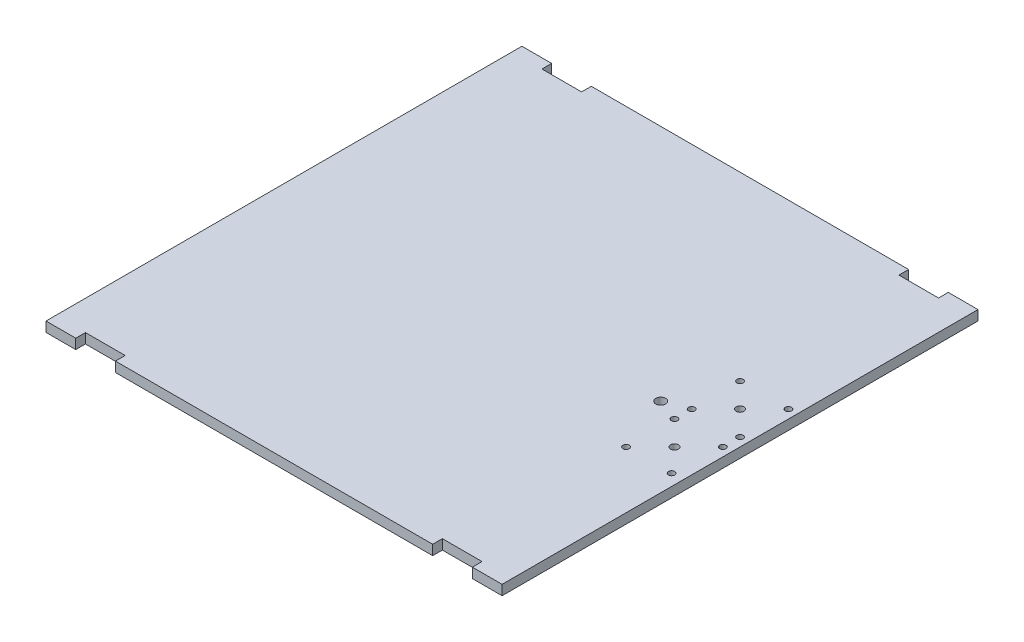
ISO-10303-21;
HEADER;
FILE_DESCRIPTION(('STEP AP214'),'2;1');
FILE_NAME('part.step','',(''),(''),'','','');
FILE_SCHEMA(('AUTOMOTIVE_DESIGN { 1 0 10303 214 1 1 1 1 }'));
ENDSEC;
DATA;
#1=APPLICATION_CONTEXT('core data for automotive mechanical design processes');
#2=APPLICATION_PROTOCOL_DEFINITION('international standard','automotive_design',2000,#1);
#3=PRODUCT_CONTEXT('',#1,'mechanical');
#4=PRODUCT('Part','Part','',(#3));
#5=PRODUCT_RELATED_PRODUCT_CATEGORY('part','',(#4));
#6=PRODUCT_DEFINITION_FORMATION('','',#4);
#7=PRODUCT_DEFINITION_CONTEXT('part definition',#1,'design');
#8=PRODUCT_DEFINITION('design','',#6,#7);
#9=PRODUCT_DEFINITION_SHAPE('','',#8);
#10=(LENGTH_UNIT() NAMED_UNIT(*) SI_UNIT(.MILLI.,.METRE.));
#11=(NAMED_UNIT(*) PLANE_ANGLE_UNIT() SI_UNIT($,.RADIAN.));
#12=(NAMED_UNIT(*) SI_UNIT($,.STERADIAN.) SOLID_ANGLE_UNIT());
#13=UNCERTAINTY_MEASURE_WITH_UNIT(LENGTH_MEASURE(1.E-05),#10,'distance_accuracy_value','');
#14=(GEOMETRIC_REPRESENTATION_CONTEXT(3) GLOBAL_UNCERTAINTY_ASSIGNED_CONTEXT((#13)) GLOBAL_UNIT_ASSIGNED_CONTEXT((#10,
#11,#12)) REPRESENTATION_CONTEXT('',''));
#15=CARTESIAN_POINT('',(0.,0.,0.));
#16=DIRECTION('',(0.,0.,1.));
#17=DIRECTION('',(1.,0.,0.));
#18=AXIS2_PLACEMENT_3D('',#15,#16,#17);
#19=CARTESIAN_POINT('',(0.,6.35,-304.8));
#20=DIRECTION('',(0.,0.,-1.));
#21=DIRECTION('',(-1.,0.,0.));
#22=AXIS2_PLACEMENT_3D('',#19,#20,#21);
#23=PLANE('',#22);
#24=DIRECTION('',(0.,1.,0.));
#25=VECTOR('',#24,1.);
#26=CARTESIAN_POINT('',(44.4500000000001,0.,-304.8));
#27=LINE('',#26,#25);
#28=CARTESIAN_POINT('',(44.4500000000001,0.,-304.8));
#29=VERTEX_POINT('',#28);
#30=CARTESIAN_POINT('',(44.4500000000001,6.35,-304.8));
#31=VERTEX_POINT('',#30);
#32=EDGE_CURVE('E376',#29,#31,#27,.T.);
#33=ORIENTED_EDGE('',*,*,#32,.T.);
#34=DIRECTION('',(1.,0.,0.));
#35=VECTOR('',#34,1.);
#36=CARTESIAN_POINT('',(0.,6.35,-304.8));
#37=LINE('',#36,#35);
#38=CARTESIAN_POINT('',(247.65,6.35,-304.8));
#39=VERTEX_POINT('',#38);
#40=EDGE_CURVE('E295',#31,#39,#37,.T.);
#41=ORIENTED_EDGE('',*,*,#40,.T.);
#42=DIRECTION('',(0.,-1.,0.));
#43=VECTOR('',#42,1.);
#44=CARTESIAN_POINT('',(247.65,6.35,-304.8));
#45=LINE('',#44,#43);
#46=CARTESIAN_POINT('',(247.65,0.,-304.8));
#47=VERTEX_POINT('',#46);
#48=EDGE_CURVE('E238',#39,#47,#45,.T.);
#49=ORIENTED_EDGE('',*,*,#48,.T.);
#50=DIRECTION('',(1.,0.,0.));
#51=VECTOR('',#50,1.);
#52=CARTESIAN_POINT('',(0.,0.,-304.8));
#53=LINE('',#52,#51);
#54=EDGE_CURVE('E269',#29,#47,#53,.T.);
#55=ORIENTED_EDGE('',*,*,#54,.F.);
#56=EDGE_LOOP('',(#33,#41,#49,#55));
#57=FACE_BOUND('',#56,.T.);
#58=ADVANCED_FACE('F39',(#57),#23,.T.);
#59=CARTESIAN_POINT('',(0.,6.35,0.));
#60=DIRECTION('',(0.,0.,-1.));
#61=DIRECTION('',(-1.,0.,0.));
#62=AXIS2_PLACEMENT_3D('',#59,#60,#61);
#63=PLANE('',#62);
#64=DIRECTION('',(1.,0.,0.));
#65=VECTOR('',#64,1.);
#66=CARTESIAN_POINT('',(0.,0.,0.));
#67=LINE('',#66,#65);
#68=CARTESIAN_POINT('',(0.,0.,0.));
#69=VERTEX_POINT('',#68);
#70=CARTESIAN_POINT('',(19.0500000000001,0.,-2.22044604925031E-13));
#71=VERTEX_POINT('',#70);
#72=EDGE_CURVE('E191',#69,#71,#67,.T.);
#73=ORIENTED_EDGE('',*,*,#72,.T.);
#74=DIRECTION('',(0.,1.,0.));
#75=VECTOR('',#74,1.);
#76=CARTESIAN_POINT('',(19.0500000000001,0.,-2.22044604925031E-13));
#77=LINE('',#76,#75);
#78=CARTESIAN_POINT('',(19.0500000000001,6.35,-2.22044604925031E-13));
#79=VERTEX_POINT('',#78);
#80=EDGE_CURVE('E175',#71,#79,#77,.T.);
#81=ORIENTED_EDGE('',*,*,#80,.T.);
#82=DIRECTION('',(1.,0.,0.));
#83=VECTOR('',#82,1.);
#84=CARTESIAN_POINT('',(0.,6.35,0.));
#85=LINE('',#84,#83);
#86=CARTESIAN_POINT('',(0.,6.35,0.));
#87=VERTEX_POINT('',#86);
#88=EDGE_CURVE('E305',#87,#79,#85,.T.);
#89=ORIENTED_EDGE('',*,*,#88,.F.);
#90=DIRECTION('',(0.,-1.,0.));
#91=VECTOR('',#90,1.);
#92=CARTESIAN_POINT('',(0.,6.35,0.));
#93=LINE('',#92,#91);
#94=EDGE_CURVE('E198',#87,#69,#93,.T.);
#95=ORIENTED_EDGE('',*,*,#94,.T.);
#96=EDGE_LOOP('',(#73,#81,#89,#95));
#97=FACE_BOUND('',#96,.T.);
#98=ADVANCED_FACE('F197',(#97),#63,.F.);
#99=CARTESIAN_POINT('',(292.1,6.35,0.));
#100=DIRECTION('',(-1.,0.,0.));
#101=DIRECTION('',(0.,0.,1.));
#102=AXIS2_PLACEMENT_3D('',#99,#100,#101);
#103=PLANE('',#102);
#104=DIRECTION('',(0.,0.,-1.));
#105=VECTOR('',#104,1.);
#106=CARTESIAN_POINT('',(292.1,0.,0.));
#107=LINE('',#106,#105);
#108=CARTESIAN_POINT('',(292.1,0.,0.));
#109=VERTEX_POINT('',#108);
#110=CARTESIAN_POINT('',(292.1,0.,-304.8));
#111=VERTEX_POINT('',#110);
#112=EDGE_CURVE('E267',#109,#111,#107,.T.);
#113=ORIENTED_EDGE('',*,*,#112,.T.);
#114=DIRECTION('',(0.,-1.,0.));
#115=VECTOR('',#114,1.);
#116=CARTESIAN_POINT('',(292.1,6.35,-304.8));
#117=LINE('',#116,#115);
#118=CARTESIAN_POINT('',(292.1,6.35,-304.8));
#119=VERTEX_POINT('',#118);
#120=EDGE_CURVE('E11',#119,#111,#117,.T.);
#121=ORIENTED_EDGE('',*,*,#120,.F.);
#122=DIRECTION('',(0.,0.,-1.));
#123=VECTOR('',#122,1.);
#124=CARTESIAN_POINT('',(292.1,6.35,0.));
#125=LINE('',#124,#123);
#126=CARTESIAN_POINT('',(292.1,6.35,0.));
#127=VERTEX_POINT('',#126);
#128=EDGE_CURVE('E207',#127,#119,#125,.T.);
#129=ORIENTED_EDGE('',*,*,#128,.F.);
#130=DIRECTION('',(0.,-1.,0.));
#131=VECTOR('',#130,1.);
#132=CARTESIAN_POINT('',(292.1,6.35,0.));
#133=LINE('',#132,#131);
#134=EDGE_CURVE('E222',#127,#109,#133,.T.);
#135=ORIENTED_EDGE('',*,*,#134,.T.);
#136=EDGE_LOOP('',(#113,#121,#129,#135));
#137=FACE_BOUND('',#136,.T.);
#138=ADVANCED_FACE('F41',(#137),#103,.F.);
#139=CARTESIAN_POINT('',(273.05,0.,-304.8));
#140=VERTEX_POINT('',#139);
#141=EDGE_CURVE('E259',#140,#111,#53,.T.);
#142=ORIENTED_EDGE('',*,*,#141,.F.);
#143=DIRECTION('',(0.,-1.,0.));
#144=VECTOR('',#143,1.);
#145=CARTESIAN_POINT('',(273.05,6.35,-304.8));
#146=LINE('',#145,#144);
#147=CARTESIAN_POINT('',(273.05,6.35,-304.8));
#148=VERTEX_POINT('',#147);
#149=EDGE_CURVE('E47',#148,#140,#146,.T.);
#150=ORIENTED_EDGE('',*,*,#149,.F.);
#151=EDGE_CURVE('E213',#148,#119,#37,.T.);
#152=ORIENTED_EDGE('',*,*,#151,.T.);
#153=ORIENTED_EDGE('',*,*,#120,.T.);
#154=EDGE_LOOP('',(#142,#150,#152,#153));
#155=FACE_BOUND('',#154,.T.);
#156=ADVANCED_FACE('F264',(#155),#23,.T.);
#157=CARTESIAN_POINT('',(273.05,6.35,0.));
#158=DIRECTION('',(1.,0.,0.));
#159=DIRECTION('',(0.,0.,-1.));
#160=AXIS2_PLACEMENT_3D('',#157,#158,#159);
#161=PLANE('',#160);
#162=DIRECTION('',(0.,0.,1.));
#163=VECTOR('',#162,1.);
#164=CARTESIAN_POINT('',(273.05,0.,0.));
#165=LINE('',#164,#163);
#166=CARTESIAN_POINT('',(273.05,0.,-298.577));
#167=VERTEX_POINT('',#166);
#168=EDGE_CURVE('E250',#140,#167,#165,.T.);
#169=ORIENTED_EDGE('',*,*,#168,.T.);
#170=DIRECTION('',(0.,-1.,0.));
#171=VECTOR('',#170,1.);
#172=CARTESIAN_POINT('',(273.05,6.35,-298.577));
#173=LINE('',#172,#171);
#174=CARTESIAN_POINT('',(273.05,6.35,-298.577));
#175=VERTEX_POINT('',#174);
#176=EDGE_CURVE('E243',#175,#167,#173,.T.);
#177=ORIENTED_EDGE('',*,*,#176,.F.);
#178=DIRECTION('',(0.,0.,1.));
#179=VECTOR('',#178,1.);
#180=CARTESIAN_POINT('',(273.05,6.35,0.));
#181=LINE('',#180,#179);
#182=EDGE_CURVE('E252',#148,#175,#181,.T.);
#183=ORIENTED_EDGE('',*,*,#182,.F.);
#184=ORIENTED_EDGE('',*,*,#149,.T.);
#185=EDGE_LOOP('',(#169,#177,#183,#184));
#186=FACE_BOUND('',#185,.T.);
#187=ADVANCED_FACE('F248',(#186),#161,.F.);
#188=CARTESIAN_POINT('',(0.,6.35,-298.577));
#189=DIRECTION('',(0.,0.,-1.));
#190=DIRECTION('',(-1.,0.,0.));
#191=AXIS2_PLACEMENT_3D('',#188,#189,#190);
#192=PLANE('',#191);
#193=DIRECTION('',(1.,0.,0.));
#194=VECTOR('',#193,1.);
#195=CARTESIAN_POINT('',(0.,0.,-298.577));
#196=LINE('',#195,#194);
#197=CARTESIAN_POINT('',(247.65,0.,-298.577));
#198=VERTEX_POINT('',#197);
#199=EDGE_CURVE('E262',#198,#167,#196,.T.);
#200=ORIENTED_EDGE('',*,*,#199,.F.);
#201=DIRECTION('',(0.,-1.,0.));
#202=VECTOR('',#201,1.);
#203=CARTESIAN_POINT('',(247.65,6.35,-298.577));
#204=LINE('',#203,#202);
#205=CARTESIAN_POINT('',(247.65,6.35,-298.577));
#206=VERTEX_POINT('',#205);
#207=EDGE_CURVE('E241',#206,#198,#204,.T.);
#208=ORIENTED_EDGE('',*,*,#207,.F.);
#209=DIRECTION('',(1.,0.,0.));
#210=VECTOR('',#209,1.);
#211=CARTESIAN_POINT('',(0.,6.35,-298.577));
#212=LINE('',#211,#210);
#213=EDGE_CURVE('E292',#206,#175,#212,.T.);
#214=ORIENTED_EDGE('',*,*,#213,.T.);
#215=ORIENTED_EDGE('',*,*,#176,.T.);
#216=EDGE_LOOP('',(#200,#208,#214,#215));
#217=FACE_BOUND('',#216,.T.);
#218=ADVANCED_FACE('F291',(#217),#192,.T.);
#219=CARTESIAN_POINT('',(247.65,6.35,0.));
#220=DIRECTION('',(1.,0.,0.));
#221=DIRECTION('',(0.,0.,-1.));
#222=AXIS2_PLACEMENT_3D('',#219,#220,#221);
#223=PLANE('',#222);
#224=DIRECTION('',(0.,0.,1.));
#225=VECTOR('',#224,1.);
#226=CARTESIAN_POINT('',(247.65,0.,0.));
#227=LINE('',#226,#225);
#228=EDGE_CURVE('E273',#47,#198,#227,.T.);
#229=ORIENTED_EDGE('',*,*,#228,.F.);
#230=ORIENTED_EDGE('',*,*,#48,.F.);
#231=DIRECTION('',(0.,0.,1.));
#232=VECTOR('',#231,1.);
#233=CARTESIAN_POINT('',(247.65,6.35,0.));
#234=LINE('',#233,#232);
#235=EDGE_CURVE('E287',#39,#206,#234,.T.);
#236=ORIENTED_EDGE('',*,*,#235,.T.);
#237=ORIENTED_EDGE('',*,*,#207,.T.);
#238=EDGE_LOOP('',(#229,#230,#236,#237));
#239=FACE_BOUND('',#238,.T.);
#240=ADVANCED_FACE('F284',(#239),#223,.T.);
#241=DIRECTION('',(0.,1.,0.));
#242=VECTOR('',#241,1.);
#243=CARTESIAN_POINT('',(19.0500000000001,0.,-304.8));
#244=LINE('',#243,#242);
#245=CARTESIAN_POINT('',(19.0500000000001,0.,-304.8));
#246=VERTEX_POINT('',#245);
#247=CARTESIAN_POINT('',(19.0500000000001,6.35,-304.8));
#248=VERTEX_POINT('',#247);
#249=EDGE_CURVE('E346',#246,#248,#244,.T.);
#250=ORIENTED_EDGE('',*,*,#249,.F.);
#251=CARTESIAN_POINT('',(0.,0.,-304.8));
#252=VERTEX_POINT('',#251);
#253=EDGE_CURVE('E270',#252,#246,#53,.T.);
#254=ORIENTED_EDGE('',*,*,#253,.F.);
#255=DIRECTION('',(0.,-1.,0.));
#256=VECTOR('',#255,1.);
#257=CARTESIAN_POINT('',(0.,6.35,-304.8));
#258=LINE('',#257,#256);
#259=CARTESIAN_POINT('',(0.,6.35,-304.8));
#260=VERTEX_POINT('',#259);
#261=EDGE_CURVE('E236',#260,#252,#258,.T.);
#262=ORIENTED_EDGE('',*,*,#261,.F.);
#263=EDGE_CURVE('E304',#260,#248,#37,.T.);
#264=ORIENTED_EDGE('',*,*,#263,.T.);
#265=EDGE_LOOP('',(#250,#254,#262,#264));
#266=FACE_BOUND('',#265,.T.);
#267=ADVANCED_FACE('F345',(#266),#23,.T.);
#268=CARTESIAN_POINT('',(0.,6.35,0.));
#269=DIRECTION('',(-1.,0.,0.));
#270=DIRECTION('',(0.,0.,1.));
#271=AXIS2_PLACEMENT_3D('',#268,#269,#270);
#272=PLANE('',#271);
#273=DIRECTION('',(0.,0.,-1.));
#274=VECTOR('',#273,1.);
#275=CARTESIAN_POINT('',(0.,0.,0.));
#276=LINE('',#275,#274);
#277=EDGE_CURVE('E205',#69,#252,#276,.T.);
#278=ORIENTED_EDGE('',*,*,#277,.F.);
#279=ORIENTED_EDGE('',*,*,#94,.F.);
#280=DIRECTION('',(0.,0.,-1.));
#281=VECTOR('',#280,1.);
#282=CARTESIAN_POINT('',(0.,6.35,0.));
#283=LINE('',#282,#281);
#284=EDGE_CURVE('E300',#87,#260,#283,.T.);
#285=ORIENTED_EDGE('',*,*,#284,.T.);
#286=ORIENTED_EDGE('',*,*,#261,.T.);
#287=EDGE_LOOP('',(#278,#279,#285,#286));
#288=FACE_BOUND('',#287,.T.);
#289=ADVANCED_FACE('F353',(#288),#272,.T.);
#290=CARTESIAN_POINT('',(44.4500000000001,6.35,-2.22044604925031E-13));
#291=VERTEX_POINT('',#290);
#292=CARTESIAN_POINT('',(247.65,6.35,0.));
#293=VERTEX_POINT('',#292);
#294=EDGE_CURVE('E303',#291,#293,#85,.T.);
#295=ORIENTED_EDGE('',*,*,#294,.F.);
#296=DIRECTION('',(0.,1.,0.));
#297=VECTOR('',#296,1.);
#298=CARTESIAN_POINT('',(44.4500000000001,0.,-2.22044604925031E-13));
#299=LINE('',#298,#297);
#300=CARTESIAN_POINT('',(44.4500000000001,0.,-2.22044604925031E-13));
#301=VERTEX_POINT('',#300);
#302=EDGE_CURVE('E185',#301,#291,#299,.T.);
#303=ORIENTED_EDGE('',*,*,#302,.F.);
#304=CARTESIAN_POINT('',(247.65,0.,0.));
#305=VERTEX_POINT('',#304);
#306=EDGE_CURVE('E200',#301,#305,#67,.T.);
#307=ORIENTED_EDGE('',*,*,#306,.T.);
#308=DIRECTION('',(0.,-1.,0.));
#309=VECTOR('',#308,1.);
#310=CARTESIAN_POINT('',(247.65,6.35,0.));
#311=LINE('',#310,#309);
#312=EDGE_CURVE('E232',#293,#305,#311,.T.);
#313=ORIENTED_EDGE('',*,*,#312,.F.);
#314=EDGE_LOOP('',(#295,#303,#307,#313));
#315=FACE_BOUND('',#314,.T.);
#316=ADVANCED_FACE('F328',(#315),#63,.F.);
#317=CARTESIAN_POINT('',(247.65,6.35,0.));
#318=DIRECTION('',(-1.,0.,0.));
#319=DIRECTION('',(0.,0.,1.));
#320=AXIS2_PLACEMENT_3D('',#317,#318,#319);
#321=PLANE('',#320);
#322=DIRECTION('',(0.,0.,-1.));
#323=VECTOR('',#322,1.);
#324=CARTESIAN_POINT('',(247.65,0.,0.));
#325=LINE('',#324,#323);
#326=CARTESIAN_POINT('',(247.65,0.,-6.223));
#327=VERTEX_POINT('',#326);
#328=EDGE_CURVE('E199',#305,#327,#325,.T.);
#329=ORIENTED_EDGE('',*,*,#328,.T.);
#330=DIRECTION('',(0.,-1.,0.));
#331=VECTOR('',#330,1.);
#332=CARTESIAN_POINT('',(247.65,6.35,-6.223));
#333=LINE('',#332,#331);
#334=CARTESIAN_POINT('',(247.65,6.35,-6.223));
#335=VERTEX_POINT('',#334);
#336=EDGE_CURVE('E229',#335,#327,#333,.T.);
#337=ORIENTED_EDGE('',*,*,#336,.F.);
#338=DIRECTION('',(0.,0.,-1.));
#339=VECTOR('',#338,1.);
#340=CARTESIAN_POINT('',(247.65,6.35,0.));
#341=LINE('',#340,#339);
#342=EDGE_CURVE('E307',#293,#335,#341,.T.);
#343=ORIENTED_EDGE('',*,*,#342,.F.);
#344=ORIENTED_EDGE('',*,*,#312,.T.);
#345=EDGE_LOOP('',(#329,#337,#343,#344));
#346=FACE_BOUND('',#345,.T.);
#347=ADVANCED_FACE('F332',(#346),#321,.F.);
#348=CARTESIAN_POINT('',(0.,6.35,-6.223));
#349=DIRECTION('',(0.,0.,-1.));
#350=DIRECTION('',(-1.,0.,0.));
#351=AXIS2_PLACEMENT_3D('',#348,#349,#350);
#352=PLANE('',#351);
#353=DIRECTION('',(1.,0.,0.));
#354=VECTOR('',#353,1.);
#355=CARTESIAN_POINT('',(0.,0.,-6.223));
#356=LINE('',#355,#354);
#357=CARTESIAN_POINT('',(273.05,0.,-6.223));
#358=VERTEX_POINT('',#357);
#359=EDGE_CURVE('E203',#327,#358,#356,.T.);
#360=ORIENTED_EDGE('',*,*,#359,.T.);
#361=DIRECTION('',(0.,-1.,0.));
#362=VECTOR('',#361,1.);
#363=CARTESIAN_POINT('',(273.05,6.35,-6.223));
#364=LINE('',#363,#362);
#365=CARTESIAN_POINT('',(273.05,6.35,-6.223));
#366=VERTEX_POINT('',#365);
#367=EDGE_CURVE('E227',#366,#358,#364,.T.);
#368=ORIENTED_EDGE('',*,*,#367,.F.);
#369=DIRECTION('',(1.,0.,0.));
#370=VECTOR('',#369,1.);
#371=CARTESIAN_POINT('',(0.,6.35,-6.223));
#372=LINE('',#371,#370);
#373=EDGE_CURVE('E309',#335,#366,#372,.T.);
#374=ORIENTED_EDGE('',*,*,#373,.F.);
#375=ORIENTED_EDGE('',*,*,#336,.T.);
#376=EDGE_LOOP('',(#360,#368,#374,#375));
#377=FACE_BOUND('',#376,.T.);
#378=ADVANCED_FACE('F336',(#377),#352,.F.);
#379=CARTESIAN_POINT('',(273.05,6.35,0.));
#380=DIRECTION('',(-1.,0.,0.));
#381=DIRECTION('',(0.,0.,1.));
#382=AXIS2_PLACEMENT_3D('',#379,#380,#381);
#383=PLANE('',#382);
#384=DIRECTION('',(0.,0.,-1.));
#385=VECTOR('',#384,1.);
#386=CARTESIAN_POINT('',(273.05,0.,0.));
#387=LINE('',#386,#385);
#388=CARTESIAN_POINT('',(273.05,0.,0.));
#389=VERTEX_POINT('',#388);
#390=EDGE_CURVE('E208',#389,#358,#387,.T.);
#391=ORIENTED_EDGE('',*,*,#390,.F.);
#392=DIRECTION('',(0.,-1.,0.));
#393=VECTOR('',#392,1.);
#394=CARTESIAN_POINT('',(273.05,6.35,0.));
#395=LINE('',#394,#393);
#396=CARTESIAN_POINT('',(273.05,6.35,0.));
#397=VERTEX_POINT('',#396);
#398=EDGE_CURVE('E224',#397,#389,#395,.T.);
#399=ORIENTED_EDGE('',*,*,#398,.F.);
#400=DIRECTION('',(0.,0.,-1.));
#401=VECTOR('',#400,1.);
#402=CARTESIAN_POINT('',(273.05,6.35,0.));
#403=LINE('',#402,#401);
#404=EDGE_CURVE('E311',#397,#366,#403,.T.);
#405=ORIENTED_EDGE('',*,*,#404,.T.);
#406=ORIENTED_EDGE('',*,*,#367,.T.);
#407=EDGE_LOOP('',(#391,#399,#405,#406));
#408=FACE_BOUND('',#407,.T.);
#409=ADVANCED_FACE('F337',(#408),#383,.T.);
#410=EDGE_CURVE('E202',#389,#109,#67,.T.);
#411=ORIENTED_EDGE('',*,*,#410,.T.);
#412=ORIENTED_EDGE('',*,*,#134,.F.);
#413=EDGE_CURVE('E225',#397,#127,#85,.T.);
#414=ORIENTED_EDGE('',*,*,#413,.F.);
#415=ORIENTED_EDGE('',*,*,#398,.T.);
#416=EDGE_LOOP('',(#411,#412,#414,#415));
#417=FACE_BOUND('',#416,.T.);
#418=ADVANCED_FACE('F338',(#417),#63,.F.);
#419=CARTESIAN_POINT('',(0.,6.35,0.));
#420=DIRECTION('',(0.,1.,0.));
#421=DIRECTION('',(0.,0.,1.));
#422=AXIS2_PLACEMENT_3D('',#419,#420,#421);
#423=PLANE('',#422);
#424=CARTESIAN_POINT('',(241.3,6.35,-152.4));
#425=DIRECTION('',(0.,1.,0.));
#426=DIRECTION('',(0.,0.,1.));
#427=AXIS2_PLACEMENT_3D('',#424,#425,#426);
#428=CIRCLE('',#427,3.175);
#429=CARTESIAN_POINT('',(241.3,6.35,-149.225));
#430=VERTEX_POINT('',#429);
#431=EDGE_CURVE('E408',#430,#430,#428,.T.);
#432=ORIENTED_EDGE('',*,*,#431,.F.);
#433=EDGE_LOOP('',(#432));
#434=FACE_BOUND('',#433,.T.);
#435=CARTESIAN_POINT('',(255.6,6.35,-115.9));
#436=DIRECTION('',(0.,1.,0.));
#437=DIRECTION('',(0.,0.,1.));
#438=AXIS2_PLACEMENT_3D('',#435,#436,#437);
#439=CIRCLE('',#438,2.);
#440=CARTESIAN_POINT('',(255.6,6.35,-113.9));
#441=VERTEX_POINT('',#440);
#442=EDGE_CURVE('E402',#441,#441,#439,.T.);
#443=ORIENTED_EDGE('',*,*,#442,.F.);
#444=EDGE_LOOP('',(#443));
#445=FACE_BOUND('',#444,.T.);
#446=CARTESIAN_POINT('',(284.763488048272,6.35,-115.9));
#447=DIRECTION('',(0.,1.,0.));
#448=DIRECTION('',(0.,0.,1.));
#449=AXIS2_PLACEMENT_3D('',#446,#447,#448);
#450=CIRCLE('',#449,2.);
#451=CARTESIAN_POINT('',(284.763488048272,6.35,-113.9));
#452=VERTEX_POINT('',#451);
#453=EDGE_CURVE('E396',#452,#452,#450,.T.);
#454=ORIENTED_EDGE('',*,*,#453,.F.);
#455=EDGE_LOOP('',(#454));
#456=FACE_BOUND('',#455,.T.);
#457=CARTESIAN_POINT('',(286.6,6.35,-146.9));
#458=DIRECTION('',(0.,1.,0.));
#459=DIRECTION('',(0.,0.,1.));
#460=AXIS2_PLACEMENT_3D('',#457,#458,#459);
#461=CIRCLE('',#460,2.);
#462=CARTESIAN_POINT('',(286.6,6.35,-144.9));
#463=VERTEX_POINT('',#462);
#464=EDGE_CURVE('E390',#463,#463,#461,.T.);
#465=ORIENTED_EDGE('',*,*,#464,.F.);
#466=EDGE_LOOP('',(#465));
#467=FACE_BOUND('',#466,.T.);
#468=CARTESIAN_POINT('',(286.6,6.35,-157.9));
#469=DIRECTION('',(0.,1.,0.));
#470=DIRECTION('',(0.,0.,1.));
#471=AXIS2_PLACEMENT_3D('',#468,#469,#470);
#472=CIRCLE('',#471,2.);
#473=CARTESIAN_POINT('',(286.6,6.35,-155.9));
#474=VERTEX_POINT('',#473);
#475=EDGE_CURVE('E428',#474,#474,#472,.T.);
#476=ORIENTED_EDGE('',*,*,#475,.F.);
#477=EDGE_LOOP('',(#476));
#478=FACE_BOUND('',#477,.T.);
#479=CARTESIAN_POINT('',(255.6,6.35,-157.9));
#480=DIRECTION('',(0.,1.,0.));
#481=DIRECTION('',(0.,0.,1.));
#482=AXIS2_PLACEMENT_3D('',#479,#480,#481);
#483=CIRCLE('',#482,2.);
#484=CARTESIAN_POINT('',(255.6,6.35,-155.9));
#485=VERTEX_POINT('',#484);
#486=EDGE_CURVE('E415',#485,#485,#483,.T.);
#487=ORIENTED_EDGE('',*,*,#486,.F.);
#488=EDGE_LOOP('',(#487));
#489=FACE_BOUND('',#488,.T.);
#490=CARTESIAN_POINT('',(255.6,6.35,-188.9));
#491=DIRECTION('',(0.,1.,0.));
#492=DIRECTION('',(0.,0.,1.));
#493=AXIS2_PLACEMENT_3D('',#490,#491,#492);
#494=CIRCLE('',#493,2.);
#495=CARTESIAN_POINT('',(255.6,6.35,-186.9));
#496=VERTEX_POINT('',#495);
#497=EDGE_CURVE('E416',#496,#496,#494,.T.);
#498=ORIENTED_EDGE('',*,*,#497,.F.);
#499=EDGE_LOOP('',(#498));
#500=FACE_BOUND('',#499,.T.);
#501=CARTESIAN_POINT('',(255.6,6.35,-146.9));
#502=DIRECTION('',(0.,1.,0.));
#503=DIRECTION('',(0.,0.,1.));
#504=AXIS2_PLACEMENT_3D('',#501,#502,#503);
#505=CIRCLE('',#504,2.);
#506=CARTESIAN_POINT('',(255.6,6.35,-144.9));
#507=VERTEX_POINT('',#506);
#508=EDGE_CURVE('E389',#507,#507,#505,.T.);
#509=ORIENTED_EDGE('',*,*,#508,.F.);
#510=EDGE_LOOP('',(#509));
#511=FACE_BOUND('',#510,.T.);
#512=CARTESIAN_POINT('',(271.1,6.35,-131.4));
#513=DIRECTION('',(0.,1.,0.));
#514=DIRECTION('',(0.,0.,1.));
#515=AXIS2_PLACEMENT_3D('',#512,#513,#514);
#516=CIRCLE('',#515,2.50000000000002);
#517=CARTESIAN_POINT('',(271.1,6.35,-128.9));
#518=VERTEX_POINT('',#517);
#519=EDGE_CURVE('E366',#518,#518,#516,.T.);
#520=ORIENTED_EDGE('',*,*,#519,.F.);
#521=EDGE_LOOP('',(#520));
#522=FACE_BOUND('',#521,.T.);
#523=CARTESIAN_POINT('',(271.1,6.35,-173.4));
#524=DIRECTION('',(0.,1.,0.));
#525=DIRECTION('',(0.,0.,1.));
#526=AXIS2_PLACEMENT_3D('',#523,#524,#525);
#527=CIRCLE('',#526,2.50000000000002);
#528=CARTESIAN_POINT('',(271.1,6.35,-170.9));
#529=VERTEX_POINT('',#528);
#530=EDGE_CURVE('E751',#529,#529,#527,.T.);
#531=ORIENTED_EDGE('',*,*,#530,.F.);
#532=EDGE_LOOP('',(#531));
#533=FACE_BOUND('',#532,.T.);
#534=DIRECTION('',(0.,0.,1.));
#535=VECTOR('',#534,1.);
#536=CARTESIAN_POINT('',(19.0500000000001,6.35,-6.22300000000022));
#537=LINE('',#536,#535);
#538=CARTESIAN_POINT('',(19.0500000000001,6.35,-6.22300000000022));
#539=VERTEX_POINT('',#538);
#540=EDGE_CURVE('E180',#539,#79,#537,.T.);
#541=ORIENTED_EDGE('',*,*,#540,.F.);
#542=DIRECTION('',(-1.,0.,0.));
#543=VECTOR('',#542,1.);
#544=CARTESIAN_POINT('',(19.0500000000001,6.35,-6.22300000000022));
#545=LINE('',#544,#543);
#546=CARTESIAN_POINT('',(44.4500000000001,6.35,-6.22300000000022));
#547=VERTEX_POINT('',#546);
#548=EDGE_CURVE('E195',#547,#539,#545,.T.);
#549=ORIENTED_EDGE('',*,*,#548,.F.);
#550=DIRECTION('',(0.,0.,-1.));
#551=VECTOR('',#550,1.);
#552=CARTESIAN_POINT('',(44.4500000000001,6.35,-6.22300000000022));
#553=LINE('',#552,#551);
#554=EDGE_CURVE('E325',#291,#547,#553,.T.);
#555=ORIENTED_EDGE('',*,*,#554,.F.);
#556=ORIENTED_EDGE('',*,*,#294,.T.);
#557=ORIENTED_EDGE('',*,*,#342,.T.);
#558=ORIENTED_EDGE('',*,*,#373,.T.);
#559=ORIENTED_EDGE('',*,*,#404,.F.);
#560=ORIENTED_EDGE('',*,*,#413,.T.);
#561=ORIENTED_EDGE('',*,*,#128,.T.);
#562=ORIENTED_EDGE('',*,*,#151,.F.);
#563=ORIENTED_EDGE('',*,*,#182,.T.);
#564=ORIENTED_EDGE('',*,*,#213,.F.);
#565=ORIENTED_EDGE('',*,*,#235,.F.);
#566=ORIENTED_EDGE('',*,*,#40,.F.);
#567=DIRECTION('',(0.,0.,-1.));
#568=VECTOR('',#567,1.);
#569=CARTESIAN_POINT('',(44.4500000000001,6.35,-304.8));
#570=LINE('',#569,#568);
#571=CARTESIAN_POINT('',(44.4500000000001,6.35,-298.577));
#572=VERTEX_POINT('',#571);
#573=EDGE_CURVE('E377',#572,#31,#570,.T.);
#574=ORIENTED_EDGE('',*,*,#573,.F.);
#575=DIRECTION('',(1.,0.,0.));
#576=VECTOR('',#575,1.);
#577=CARTESIAN_POINT('',(44.4500000000001,6.35,-298.577));
#578=LINE('',#577,#576);
#579=CARTESIAN_POINT('',(19.0500000000001,6.35,-298.577));
#580=VERTEX_POINT('',#579);
#581=EDGE_CURVE('E373',#580,#572,#578,.T.);
#582=ORIENTED_EDGE('',*,*,#581,.F.);
#583=DIRECTION('',(0.,0.,1.));
#584=VECTOR('',#583,1.);
#585=CARTESIAN_POINT('',(19.0500000000001,6.35,-304.8));
#586=LINE('',#585,#584);
#587=EDGE_CURVE('E351',#248,#580,#586,.T.);
#588=ORIENTED_EDGE('',*,*,#587,.F.);
#589=ORIENTED_EDGE('',*,*,#263,.F.);
#590=ORIENTED_EDGE('',*,*,#284,.F.);
#591=ORIENTED_EDGE('',*,*,#88,.T.);
#592=EDGE_LOOP('',(#541,#549,#555,#556,#557,#558,#559,#560,#561,#562,#563,#564,#565,#566,#574,
#582,#588,#589,#590,#591));
#593=FACE_BOUND('',#592,.T.);
#594=CARTESIAN_POINT('',(286.6,6.35,-188.9));
#595=DIRECTION('',(0.,1.,0.));
#596=DIRECTION('',(0.,0.,1.));
#597=AXIS2_PLACEMENT_3D('',#594,#595,#596);
#598=CIRCLE('',#597,2.);
#599=CARTESIAN_POINT('',(286.6,6.35,-186.9));
#600=VERTEX_POINT('',#599);
#601=EDGE_CURVE('E427',#600,#600,#598,.T.);
#602=ORIENTED_EDGE('',*,*,#601,.F.);
#603=EDGE_LOOP('',(#602));
#604=FACE_BOUND('',#603,.T.);
#605=ADVANCED_FACE('F319',(#434,#445,#456,#467,#478,#489,#500,#511,#522,#533,#593,#604),#423,.T.);
#606=CARTESIAN_POINT('',(0.,0.,0.));
#607=DIRECTION('',(0.,1.,0.));
#608=DIRECTION('',(0.,0.,1.));
#609=AXIS2_PLACEMENT_3D('',#606,#607,#608);
#610=PLANE('',#609);
#611=CARTESIAN_POINT('',(241.3,0.,-152.4));
#612=DIRECTION('',(0.,1.,0.));
#613=DIRECTION('',(0.,0.,1.));
#614=AXIS2_PLACEMENT_3D('',#611,#612,#613);
#615=CIRCLE('',#614,3.175);
#616=CARTESIAN_POINT('',(241.3,0.,-149.225));
#617=VERTEX_POINT('',#616);
#618=EDGE_CURVE('E405',#617,#617,#615,.T.);
#619=ORIENTED_EDGE('',*,*,#618,.T.);
#620=EDGE_LOOP('',(#619));
#621=FACE_BOUND('',#620,.T.);
#622=CARTESIAN_POINT('',(255.6,0.,-115.9));
#623=DIRECTION('',(0.,1.,0.));
#624=DIRECTION('',(0.,0.,1.));
#625=AXIS2_PLACEMENT_3D('',#622,#623,#624);
#626=CIRCLE('',#625,2.);
#627=CARTESIAN_POINT('',(255.6,0.,-113.9));
#628=VERTEX_POINT('',#627);
#629=EDGE_CURVE('E399',#628,#628,#626,.T.);
#630=ORIENTED_EDGE('',*,*,#629,.T.);
#631=EDGE_LOOP('',(#630));
#632=FACE_BOUND('',#631,.T.);
#633=CARTESIAN_POINT('',(284.763488048272,0.,-115.9));
#634=DIRECTION('',(0.,1.,0.));
#635=DIRECTION('',(0.,0.,1.));
#636=AXIS2_PLACEMENT_3D('',#633,#634,#635);
#637=CIRCLE('',#636,2.);
#638=CARTESIAN_POINT('',(284.763488048272,0.,-113.9));
#639=VERTEX_POINT('',#638);
#640=EDGE_CURVE('E393',#639,#639,#637,.T.);
#641=ORIENTED_EDGE('',*,*,#640,.T.);
#642=EDGE_LOOP('',(#641));
#643=FACE_BOUND('',#642,.T.);
#644=CARTESIAN_POINT('',(286.6,0.,-146.9));
#645=DIRECTION('',(0.,1.,0.));
#646=DIRECTION('',(0.,0.,1.));
#647=AXIS2_PLACEMENT_3D('',#644,#645,#646);
#648=CIRCLE('',#647,2.);
#649=CARTESIAN_POINT('',(286.6,0.,-144.9));
#650=VERTEX_POINT('',#649);
#651=EDGE_CURVE('E386',#650,#650,#648,.T.);
#652=ORIENTED_EDGE('',*,*,#651,.T.);
#653=EDGE_LOOP('',(#652));
#654=FACE_BOUND('',#653,.T.);
#655=CARTESIAN_POINT('',(286.6,0.,-157.9));
#656=DIRECTION('',(0.,1.,0.));
#657=DIRECTION('',(0.,0.,1.));
#658=AXIS2_PLACEMENT_3D('',#655,#656,#657);
#659=CIRCLE('',#658,2.);
#660=CARTESIAN_POINT('',(286.6,0.,-155.9));
#661=VERTEX_POINT('',#660);
#662=EDGE_CURVE('E424',#661,#661,#659,.T.);
#663=ORIENTED_EDGE('',*,*,#662,.T.);
#664=EDGE_LOOP('',(#663));
#665=FACE_BOUND('',#664,.T.);
#666=CARTESIAN_POINT('',(255.6,0.,-157.9));
#667=DIRECTION('',(0.,1.,0.));
#668=DIRECTION('',(0.,0.,1.));
#669=AXIS2_PLACEMENT_3D('',#666,#667,#668);
#670=CIRCLE('',#669,2.);
#671=CARTESIAN_POINT('',(255.6,0.,-155.9));
#672=VERTEX_POINT('',#671);
#673=EDGE_CURVE('E431',#672,#672,#670,.T.);
#674=ORIENTED_EDGE('',*,*,#673,.T.);
#675=EDGE_LOOP('',(#674));
#676=FACE_BOUND('',#675,.T.);
#677=CARTESIAN_POINT('',(255.6,0.,-188.9));
#678=DIRECTION('',(0.,1.,0.));
#679=DIRECTION('',(0.,0.,1.));
#680=AXIS2_PLACEMENT_3D('',#677,#678,#679);
#681=CIRCLE('',#680,2.);
#682=CARTESIAN_POINT('',(255.6,0.,-186.9));
#683=VERTEX_POINT('',#682);
#684=EDGE_CURVE('E412',#683,#683,#681,.T.);
#685=ORIENTED_EDGE('',*,*,#684,.T.);
#686=EDGE_LOOP('',(#685));
#687=FACE_BOUND('',#686,.T.);
#688=CARTESIAN_POINT('',(255.6,0.,-146.9));
#689=DIRECTION('',(0.,1.,0.));
#690=DIRECTION('',(0.,0.,1.));
#691=AXIS2_PLACEMENT_3D('',#688,#689,#690);
#692=CIRCLE('',#691,2.);
#693=CARTESIAN_POINT('',(255.6,0.,-144.9));
#694=VERTEX_POINT('',#693);
#695=EDGE_CURVE('E419',#694,#694,#692,.T.);
#696=ORIENTED_EDGE('',*,*,#695,.T.);
#697=EDGE_LOOP('',(#696));
#698=FACE_BOUND('',#697,.T.);
#699=CARTESIAN_POINT('',(271.1,0.,-131.4));
#700=DIRECTION('',(0.,1.,0.));
#701=DIRECTION('',(0.,0.,1.));
#702=AXIS2_PLACEMENT_3D('',#699,#700,#701);
#703=CIRCLE('',#702,2.50000000000002);
#704=CARTESIAN_POINT('',(271.1,0.,-128.9));
#705=VERTEX_POINT('',#704);
#706=EDGE_CURVE('E746',#705,#705,#703,.T.);
#707=ORIENTED_EDGE('',*,*,#706,.T.);
#708=EDGE_LOOP('',(#707));
#709=FACE_BOUND('',#708,.T.);
#710=CARTESIAN_POINT('',(271.1,0.,-173.4));
#711=DIRECTION('',(0.,1.,0.));
#712=DIRECTION('',(0.,0.,1.));
#713=AXIS2_PLACEMENT_3D('',#710,#711,#712);
#714=CIRCLE('',#713,2.50000000000002);
#715=CARTESIAN_POINT('',(271.1,0.,-170.9));
#716=VERTEX_POINT('',#715);
#717=EDGE_CURVE('E411',#716,#716,#714,.T.);
#718=ORIENTED_EDGE('',*,*,#717,.T.);
#719=EDGE_LOOP('',(#718));
#720=FACE_BOUND('',#719,.T.);
#721=CARTESIAN_POINT('',(286.6,0.,-188.9));
#722=DIRECTION('',(0.,1.,0.));
#723=DIRECTION('',(0.,0.,1.));
#724=AXIS2_PLACEMENT_3D('',#721,#722,#723);
#725=CIRCLE('',#724,2.);
#726=CARTESIAN_POINT('',(286.6,0.,-186.9));
#727=VERTEX_POINT('',#726);
#728=EDGE_CURVE('E271',#727,#727,#725,.T.);
#729=ORIENTED_EDGE('',*,*,#728,.T.);
#730=EDGE_LOOP('',(#729));
#731=FACE_BOUND('',#730,.T.);
#732=DIRECTION('',(-1.,0.,0.));
#733=VECTOR('',#732,1.);
#734=CARTESIAN_POINT('',(19.0500000000001,0.,-6.22300000000022));
#735=LINE('',#734,#733);
#736=CARTESIAN_POINT('',(44.4500000000001,0.,-6.22300000000022));
#737=VERTEX_POINT('',#736);
#738=CARTESIAN_POINT('',(19.0500000000001,0.,-6.22300000000022));
#739=VERTEX_POINT('',#738);
#740=EDGE_CURVE('E54',#737,#739,#735,.T.);
#741=ORIENTED_EDGE('',*,*,#740,.T.);
#742=DIRECTION('',(0.,0.,1.));
#743=VECTOR('',#742,1.);
#744=CARTESIAN_POINT('',(19.0500000000001,0.,-6.22300000000022));
#745=LINE('',#744,#743);
#746=EDGE_CURVE('E178',#739,#71,#745,.T.);
#747=ORIENTED_EDGE('',*,*,#746,.T.);
#748=ORIENTED_EDGE('',*,*,#72,.F.);
#749=ORIENTED_EDGE('',*,*,#277,.T.);
#750=ORIENTED_EDGE('',*,*,#253,.T.);
#751=DIRECTION('',(0.,0.,1.));
#752=VECTOR('',#751,1.);
#753=CARTESIAN_POINT('',(19.0500000000001,0.,-304.8));
#754=LINE('',#753,#752);
#755=CARTESIAN_POINT('',(19.0500000000001,0.,-298.577));
#756=VERTEX_POINT('',#755);
#757=EDGE_CURVE('E372',#246,#756,#754,.T.);
#758=ORIENTED_EDGE('',*,*,#757,.T.);
#759=DIRECTION('',(1.,0.,0.));
#760=VECTOR('',#759,1.);
#761=CARTESIAN_POINT('',(44.4500000000001,0.,-298.577));
#762=LINE('',#761,#760);
#763=CARTESIAN_POINT('',(44.4500000000001,0.,-298.577));
#764=VERTEX_POINT('',#763);
#765=EDGE_CURVE('E62',#756,#764,#762,.T.);
#766=ORIENTED_EDGE('',*,*,#765,.T.);
#767=DIRECTION('',(0.,0.,-1.));
#768=VECTOR('',#767,1.);
#769=CARTESIAN_POINT('',(44.4500000000001,0.,-304.8));
#770=LINE('',#769,#768);
#771=EDGE_CURVE('E370',#764,#29,#770,.T.);
#772=ORIENTED_EDGE('',*,*,#771,.T.);
#773=ORIENTED_EDGE('',*,*,#54,.T.);
#774=ORIENTED_EDGE('',*,*,#228,.T.);
#775=ORIENTED_EDGE('',*,*,#199,.T.);
#776=ORIENTED_EDGE('',*,*,#168,.F.);
#777=ORIENTED_EDGE('',*,*,#141,.T.);
#778=ORIENTED_EDGE('',*,*,#112,.F.);
#779=ORIENTED_EDGE('',*,*,#410,.F.);
#780=ORIENTED_EDGE('',*,*,#390,.T.);
#781=ORIENTED_EDGE('',*,*,#359,.F.);
#782=ORIENTED_EDGE('',*,*,#328,.F.);
#783=ORIENTED_EDGE('',*,*,#306,.F.);
#784=DIRECTION('',(0.,0.,-1.));
#785=VECTOR('',#784,1.);
#786=CARTESIAN_POINT('',(44.4500000000001,0.,-6.22300000000022));
#787=LINE('',#786,#785);
#788=EDGE_CURVE('E194',#301,#737,#787,.T.);
#789=ORIENTED_EDGE('',*,*,#788,.T.);
#790=EDGE_LOOP('',(#741,#747,#748,#749,#750,#758,#766,#772,#773,#774,#775,#776,#777,#778,#779,
#780,#781,#782,#783,#789));
#791=FACE_BOUND('',#790,.T.);
#792=ADVANCED_FACE('F189',(#621,#632,#643,#654,#665,#676,#687,#698,#709,#720,#731,#791),#610,.F.);
#793=CARTESIAN_POINT('',(286.6,0.,-188.9));
#794=DIRECTION('',(0.,1.,0.));
#795=DIRECTION('',(0.,0.,1.));
#796=AXIS2_PLACEMENT_3D('',#793,#794,#795);
#797=CYLINDRICAL_SURFACE('',#796,2.);
#798=ORIENTED_EDGE('',*,*,#728,.F.);
#799=EDGE_LOOP('',(#798));
#800=FACE_BOUND('',#799,.T.);
#801=ORIENTED_EDGE('',*,*,#601,.T.);
#802=EDGE_LOOP('',(#801));
#803=FACE_BOUND('',#802,.T.);
#804=ADVANCED_FACE('F441',(#800,#803),#797,.F.);
#805=CARTESIAN_POINT('',(44.4500000000001,0.,-304.8));
#806=DIRECTION('',(1.,0.,0.));
#807=DIRECTION('',(0.,0.,-1.));
#808=AXIS2_PLACEMENT_3D('',#805,#806,#807);
#809=PLANE('',#808);
#810=ORIENTED_EDGE('',*,*,#573,.T.);
#811=ORIENTED_EDGE('',*,*,#32,.F.);
#812=ORIENTED_EDGE('',*,*,#771,.F.);
#813=DIRECTION('',(0.,1.,0.));
#814=VECTOR('',#813,1.);
#815=CARTESIAN_POINT('',(44.4500000000001,0.,-298.577));
#816=LINE('',#815,#814);
#817=EDGE_CURVE('E355',#764,#572,#816,.T.);
#818=ORIENTED_EDGE('',*,*,#817,.T.);
#819=EDGE_LOOP('',(#810,#811,#812,#818));
#820=FACE_BOUND('',#819,.T.);
#821=ADVANCED_FACE('F548',(#820),#809,.F.);
#822=CARTESIAN_POINT('',(44.4500000000001,0.,-298.577));
#823=DIRECTION('',(0.,0.,1.));
#824=DIRECTION('',(1.,0.,0.));
#825=AXIS2_PLACEMENT_3D('',#822,#823,#824);
#826=PLANE('',#825);
#827=ORIENTED_EDGE('',*,*,#581,.T.);
#828=ORIENTED_EDGE('',*,*,#817,.F.);
#829=ORIENTED_EDGE('',*,*,#765,.F.);
#830=DIRECTION('',(0.,1.,0.));
#831=VECTOR('',#830,1.);
#832=CARTESIAN_POINT('',(19.0500000000001,0.,-298.577));
#833=LINE('',#832,#831);
#834=EDGE_CURVE('E358',#756,#580,#833,.T.);
#835=ORIENTED_EDGE('',*,*,#834,.T.);
#836=EDGE_LOOP('',(#827,#828,#829,#835));
#837=FACE_BOUND('',#836,.T.);
#838=ADVANCED_FACE('F556',(#837),#826,.F.);
#839=CARTESIAN_POINT('',(19.0500000000001,0.,-304.8));
#840=DIRECTION('',(-1.,0.,0.));
#841=DIRECTION('',(0.,0.,1.));
#842=AXIS2_PLACEMENT_3D('',#839,#840,#841);
#843=PLANE('',#842);
#844=ORIENTED_EDGE('',*,*,#587,.T.);
#845=ORIENTED_EDGE('',*,*,#834,.F.);
#846=ORIENTED_EDGE('',*,*,#757,.F.);
#847=ORIENTED_EDGE('',*,*,#249,.T.);
#848=EDGE_LOOP('',(#844,#845,#846,#847));
#849=FACE_BOUND('',#848,.T.);
#850=ADVANCED_FACE('F565',(#849),#843,.F.);
#851=CARTESIAN_POINT('',(19.0500000000001,0.,-6.22300000000022));
#852=DIRECTION('',(-1.,0.,0.));
#853=DIRECTION('',(0.,0.,1.));
#854=AXIS2_PLACEMENT_3D('',#851,#852,#853);
#855=PLANE('',#854);
#856=ORIENTED_EDGE('',*,*,#540,.T.);
#857=ORIENTED_EDGE('',*,*,#80,.F.);
#858=ORIENTED_EDGE('',*,*,#746,.F.);
#859=DIRECTION('',(0.,1.,0.));
#860=VECTOR('',#859,1.);
#861=CARTESIAN_POINT('',(19.0500000000001,0.,-6.22300000000022));
#862=LINE('',#861,#860);
#863=EDGE_CURVE('E364',#739,#539,#862,.T.);
#864=ORIENTED_EDGE('',*,*,#863,.T.);
#865=EDGE_LOOP('',(#856,#857,#858,#864));
#866=FACE_BOUND('',#865,.T.);
#867=ADVANCED_FACE('F177',(#866),#855,.F.);
#868=CARTESIAN_POINT('',(19.0500000000001,0.,-6.22300000000022));
#869=DIRECTION('',(0.,0.,-1.));
#870=DIRECTION('',(-1.,0.,0.));
#871=AXIS2_PLACEMENT_3D('',#868,#869,#870);
#872=PLANE('',#871);
#873=ORIENTED_EDGE('',*,*,#548,.T.);
#874=ORIENTED_EDGE('',*,*,#863,.F.);
#875=ORIENTED_EDGE('',*,*,#740,.F.);
#876=DIRECTION('',(0.,1.,0.));
#877=VECTOR('',#876,1.);
#878=CARTESIAN_POINT('',(44.4500000000001,0.,-6.22300000000022));
#879=LINE('',#878,#877);
#880=EDGE_CURVE('E367',#737,#547,#879,.T.);
#881=ORIENTED_EDGE('',*,*,#880,.T.);
#882=EDGE_LOOP('',(#873,#874,#875,#881));
#883=FACE_BOUND('',#882,.T.);
#884=ADVANCED_FACE('F581',(#883),#872,.F.);
#885=CARTESIAN_POINT('',(44.4500000000001,0.,-6.22300000000022));
#886=DIRECTION('',(1.,0.,0.));
#887=DIRECTION('',(0.,0.,-1.));
#888=AXIS2_PLACEMENT_3D('',#885,#886,#887);
#889=PLANE('',#888);
#890=ORIENTED_EDGE('',*,*,#554,.T.);
#891=ORIENTED_EDGE('',*,*,#880,.F.);
#892=ORIENTED_EDGE('',*,*,#788,.F.);
#893=ORIENTED_EDGE('',*,*,#302,.T.);
#894=EDGE_LOOP('',(#890,#891,#892,#893));
#895=FACE_BOUND('',#894,.T.);
#896=ADVANCED_FACE('F589',(#895),#889,.F.);
#897=CARTESIAN_POINT('',(271.1,0.,-173.4));
#898=DIRECTION('',(0.,1.,0.));
#899=DIRECTION('',(0.,0.,1.));
#900=AXIS2_PLACEMENT_3D('',#897,#898,#899);
#901=CYLINDRICAL_SURFACE('',#900,2.50000000000002);
#902=ORIENTED_EDGE('',*,*,#717,.F.);
#903=EDGE_LOOP('',(#902));
#904=FACE_BOUND('',#903,.T.);
#905=ORIENTED_EDGE('',*,*,#530,.T.);
#906=EDGE_LOOP('',(#905));
#907=FACE_BOUND('',#906,.T.);
#908=ADVANCED_FACE('F597',(#904,#907),#901,.F.);
#909=CARTESIAN_POINT('',(271.1,0.,-131.4));
#910=DIRECTION('',(0.,1.,0.));
#911=DIRECTION('',(0.,0.,1.));
#912=AXIS2_PLACEMENT_3D('',#909,#910,#911);
#913=CYLINDRICAL_SURFACE('',#912,2.50000000000002);
#914=ORIENTED_EDGE('',*,*,#706,.F.);
#915=EDGE_LOOP('',(#914));
#916=FACE_BOUND('',#915,.T.);
#917=ORIENTED_EDGE('',*,*,#519,.T.);
#918=EDGE_LOOP('',(#917));
#919=FACE_BOUND('',#918,.T.);
#920=ADVANCED_FACE('F606',(#916,#919),#913,.F.);
#921=CARTESIAN_POINT('',(255.6,0.,-146.9));
#922=DIRECTION('',(0.,1.,0.));
#923=DIRECTION('',(0.,0.,1.));
#924=AXIS2_PLACEMENT_3D('',#921,#922,#923);
#925=CYLINDRICAL_SURFACE('',#924,2.);
#926=ORIENTED_EDGE('',*,*,#695,.F.);
#927=EDGE_LOOP('',(#926));
#928=FACE_BOUND('',#927,.T.);
#929=ORIENTED_EDGE('',*,*,#508,.T.);
#930=EDGE_LOOP('',(#929));
#931=FACE_BOUND('',#930,.T.);
#932=ADVANCED_FACE('F615',(#928,#931),#925,.F.);
#933=CARTESIAN_POINT('',(255.6,0.,-188.9));
#934=DIRECTION('',(0.,1.,0.));
#935=DIRECTION('',(0.,0.,1.));
#936=AXIS2_PLACEMENT_3D('',#933,#934,#935);
#937=CYLINDRICAL_SURFACE('',#936,2.);
#938=ORIENTED_EDGE('',*,*,#684,.F.);
#939=EDGE_LOOP('',(#938));
#940=FACE_BOUND('',#939,.T.);
#941=ORIENTED_EDGE('',*,*,#497,.T.);
#942=EDGE_LOOP('',(#941));
#943=FACE_BOUND('',#942,.T.);
#944=ADVANCED_FACE('F624',(#940,#943),#937,.F.);
#945=CARTESIAN_POINT('',(255.6,0.,-157.9));
#946=DIRECTION('',(0.,1.,0.));
#947=DIRECTION('',(0.,0.,1.));
#948=AXIS2_PLACEMENT_3D('',#945,#946,#947);
#949=CYLINDRICAL_SURFACE('',#948,2.);
#950=ORIENTED_EDGE('',*,*,#673,.F.);
#951=EDGE_LOOP('',(#950));
#952=FACE_BOUND('',#951,.T.);
#953=ORIENTED_EDGE('',*,*,#486,.T.);
#954=EDGE_LOOP('',(#953));
#955=FACE_BOUND('',#954,.T.);
#956=ADVANCED_FACE('F633',(#952,#955),#949,.F.);
#957=CARTESIAN_POINT('',(286.6,0.,-157.9));
#958=DIRECTION('',(0.,1.,0.));
#959=DIRECTION('',(0.,0.,1.));
#960=AXIS2_PLACEMENT_3D('',#957,#958,#959);
#961=CYLINDRICAL_SURFACE('',#960,2.);
#962=ORIENTED_EDGE('',*,*,#662,.F.);
#963=EDGE_LOOP('',(#962));
#964=FACE_BOUND('',#963,.T.);
#965=ORIENTED_EDGE('',*,*,#475,.T.);
#966=EDGE_LOOP('',(#965));
#967=FACE_BOUND('',#966,.T.);
#968=ADVANCED_FACE('F642',(#964,#967),#961,.F.);
#969=CARTESIAN_POINT('',(286.6,0.,-146.9));
#970=DIRECTION('',(0.,1.,0.));
#971=DIRECTION('',(0.,0.,1.));
#972=AXIS2_PLACEMENT_3D('',#969,#970,#971);
#973=CYLINDRICAL_SURFACE('',#972,2.);
#974=ORIENTED_EDGE('',*,*,#651,.F.);
#975=EDGE_LOOP('',(#974));
#976=FACE_BOUND('',#975,.T.);
#977=ORIENTED_EDGE('',*,*,#464,.T.);
#978=EDGE_LOOP('',(#977));
#979=FACE_BOUND('',#978,.T.);
#980=ADVANCED_FACE('F651',(#976,#979),#973,.F.);
#981=CARTESIAN_POINT('',(284.763488048272,0.,-115.9));
#982=DIRECTION('',(0.,1.,0.));
#983=DIRECTION('',(0.,0.,1.));
#984=AXIS2_PLACEMENT_3D('',#981,#982,#983);
#985=CYLINDRICAL_SURFACE('',#984,2.);
#986=ORIENTED_EDGE('',*,*,#640,.F.);
#987=EDGE_LOOP('',(#986));
#988=FACE_BOUND('',#987,.T.);
#989=ORIENTED_EDGE('',*,*,#453,.T.);
#990=EDGE_LOOP('',(#989));
#991=FACE_BOUND('',#990,.T.);
#992=ADVANCED_FACE('F660',(#988,#991),#985,.F.);
#993=CARTESIAN_POINT('',(255.6,0.,-115.9));
#994=DIRECTION('',(0.,1.,0.));
#995=DIRECTION('',(0.,0.,1.));
#996=AXIS2_PLACEMENT_3D('',#993,#994,#995);
#997=CYLINDRICAL_SURFACE('',#996,2.);
#998=ORIENTED_EDGE('',*,*,#629,.F.);
#999=EDGE_LOOP('',(#998));
#1000=FACE_BOUND('',#999,.T.);
#1001=ORIENTED_EDGE('',*,*,#442,.T.);
#1002=EDGE_LOOP('',(#1001));
#1003=FACE_BOUND('',#1002,.T.);
#1004=ADVANCED_FACE('F669',(#1000,#1003),#997,.F.);
#1005=CARTESIAN_POINT('',(241.3,0.,-152.4));
#1006=DIRECTION('',(0.,1.,0.));
#1007=DIRECTION('',(0.,0.,1.));
#1008=AXIS2_PLACEMENT_3D('',#1005,#1006,#1007);
#1009=CYLINDRICAL_SURFACE('',#1008,3.175);
#1010=ORIENTED_EDGE('',*,*,#618,.F.);
#1011=EDGE_LOOP('',(#1010));
#1012=FACE_BOUND('',#1011,.T.);
#1013=ORIENTED_EDGE('',*,*,#431,.T.);
#1014=EDGE_LOOP('',(#1013));
#1015=FACE_BOUND('',#1014,.T.);
#1016=ADVANCED_FACE('F678',(#1012,#1015),#1009,.F.);
#1017=CLOSED_SHELL('',(#58,#98,#138,#156,#187,#218,#240,#267,#289,#316,#347,#378,#409,#418,#605,
#792,#804,#821,#838,#850,#867,#884,#896,#908,#920,#932,#944,#956,#968,#980,#992,#1004,#1016));
#1018=MANIFOLD_SOLID_BREP('B2',#1017);
#1019=ADVANCED_BREP_SHAPE_REPRESENTATION('',(#18,#1018),#14);
#1020=SHAPE_DEFINITION_REPRESENTATION(#9,#1019);
ENDSEC;
END-ISO-10303-21;
